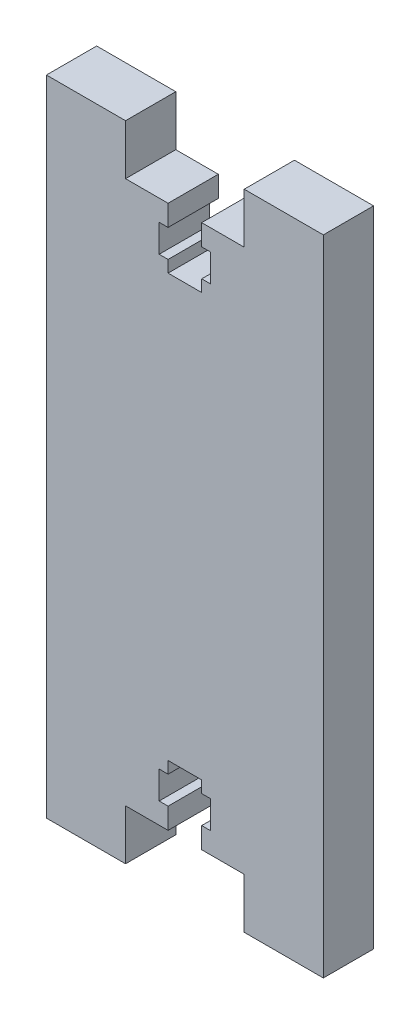
ISO-10303-21;
HEADER;
FILE_DESCRIPTION(('STEP AP214'),'2;1');
FILE_NAME('part.step','',(''),(''),'','','');
FILE_SCHEMA(('AUTOMOTIVE_DESIGN { 1 0 10303 214 1 1 1 1 }'));
ENDSEC;
DATA;
#1=APPLICATION_CONTEXT('core data for automotive mechanical design processes');
#2=APPLICATION_PROTOCOL_DEFINITION('international standard','automotive_design',2000,#1);
#3=PRODUCT_CONTEXT('',#1,'mechanical');
#4=PRODUCT('Part','Part','',(#3));
#5=PRODUCT_RELATED_PRODUCT_CATEGORY('part','',(#4));
#6=PRODUCT_DEFINITION_FORMATION('','',#4);
#7=PRODUCT_DEFINITION_CONTEXT('part definition',#1,'design');
#8=PRODUCT_DEFINITION('design','',#6,#7);
#9=PRODUCT_DEFINITION_SHAPE('','',#8);
#10=(LENGTH_UNIT() NAMED_UNIT(*) SI_UNIT(.MILLI.,.METRE.));
#11=(NAMED_UNIT(*) PLANE_ANGLE_UNIT() SI_UNIT($,.RADIAN.));
#12=(NAMED_UNIT(*) SI_UNIT($,.STERADIAN.) SOLID_ANGLE_UNIT());
#13=UNCERTAINTY_MEASURE_WITH_UNIT(LENGTH_MEASURE(1.E-05),#10,'distance_accuracy_value','');
#14=(GEOMETRIC_REPRESENTATION_CONTEXT(3) GLOBAL_UNCERTAINTY_ASSIGNED_CONTEXT((#13)) GLOBAL_UNIT_ASSIGNED_CONTEXT((#10,
#11,#12)) REPRESENTATION_CONTEXT('',''));
#15=CARTESIAN_POINT('',(0.,0.,0.));
#16=DIRECTION('',(0.,0.,1.));
#17=DIRECTION('',(1.,0.,0.));
#18=AXIS2_PLACEMENT_3D('',#15,#16,#17);
#19=CARTESIAN_POINT('',(4.24999999999902,0.,6.35));
#20=DIRECTION('',(-1.,0.,0.));
#21=DIRECTION('',(0.,-1.,0.));
#22=AXIS2_PLACEMENT_3D('',#19,#20,#21);
#23=PLANE('',#22);
#24=DIRECTION('',(0.,1.,0.));
#25=VECTOR('',#24,1.);
#26=CARTESIAN_POINT('',(4.24999999999902,0.,-6.35));
#27=LINE('',#26,#25);
#28=CARTESIAN_POINT('',(4.25000000000004,-68.65,-6.35));
#29=VERTEX_POINT('',#28);
#30=CARTESIAN_POINT('',(4.25,-63.35,-6.35));
#31=VERTEX_POINT('',#30);
#32=EDGE_CURVE('E299',#29,#31,#27,.T.);
#33=ORIENTED_EDGE('',*,*,#32,.F.);
#34=DIRECTION('',(0.,0.,-1.));
#35=VECTOR('',#34,1.);
#36=CARTESIAN_POINT('',(4.25000000000004,-68.65,6.35));
#37=LINE('',#36,#35);
#38=CARTESIAN_POINT('',(4.25000000000004,-68.65,6.35));
#39=VERTEX_POINT('',#38);
#40=EDGE_CURVE('E11',#39,#29,#37,.T.);
#41=ORIENTED_EDGE('',*,*,#40,.F.);
#42=DIRECTION('',(0.,1.,0.));
#43=VECTOR('',#42,1.);
#44=CARTESIAN_POINT('',(4.24999999999902,0.,6.35));
#45=LINE('',#44,#43);
#46=CARTESIAN_POINT('',(4.25,-63.35,6.35));
#47=VERTEX_POINT('',#46);
#48=EDGE_CURVE('E544',#39,#47,#45,.T.);
#49=ORIENTED_EDGE('',*,*,#48,.T.);
#50=DIRECTION('',(0.,0.,-1.));
#51=VECTOR('',#50,1.);
#52=CARTESIAN_POINT('',(4.25,-63.35,6.35));
#53=LINE('',#52,#51);
#54=EDGE_CURVE('E51',#47,#31,#53,.T.);
#55=ORIENTED_EDGE('',*,*,#54,.T.);
#56=EDGE_LOOP('',(#33,#41,#49,#55));
#57=FACE_BOUND('',#56,.T.);
#58=ADVANCED_FACE('F35',(#57),#23,.T.);
#59=CARTESIAN_POINT('',(0.,-68.65,6.35));
#60=DIRECTION('',(0.,1.,0.));
#61=DIRECTION('',(-1.,0.,0.));
#62=AXIS2_PLACEMENT_3D('',#59,#60,#61);
#63=PLANE('',#62);
#64=DIRECTION('',(1.,0.,0.));
#65=VECTOR('',#64,1.);
#66=CARTESIAN_POINT('',(0.,-68.65,-6.35));
#67=LINE('',#66,#65);
#68=CARTESIAN_POINT('',(15.,-68.65,-6.35));
#69=VERTEX_POINT('',#68);
#70=EDGE_CURVE('E301',#29,#69,#67,.T.);
#71=ORIENTED_EDGE('',*,*,#70,.T.);
#72=DIRECTION('',(0.,0.,-1.));
#73=VECTOR('',#72,1.);
#74=CARTESIAN_POINT('',(15.,-68.65,6.35));
#75=LINE('',#74,#73);
#76=CARTESIAN_POINT('',(15.,-68.65,6.35));
#77=VERTEX_POINT('',#76);
#78=EDGE_CURVE('E43',#77,#69,#75,.T.);
#79=ORIENTED_EDGE('',*,*,#78,.F.);
#80=DIRECTION('',(1.,0.,0.));
#81=VECTOR('',#80,1.);
#82=CARTESIAN_POINT('',(0.,-68.65,6.35));
#83=LINE('',#82,#81);
#84=EDGE_CURVE('E479',#39,#77,#83,.T.);
#85=ORIENTED_EDGE('',*,*,#84,.F.);
#86=ORIENTED_EDGE('',*,*,#40,.T.);
#87=EDGE_LOOP('',(#71,#79,#85,#86));
#88=FACE_BOUND('',#87,.T.);
#89=ADVANCED_FACE('F681',(#88),#63,.F.);
#90=CARTESIAN_POINT('',(15.,0.,6.35));
#91=DIRECTION('',(1.,0.,0.));
#92=DIRECTION('',(0.,0.,-1.));
#93=AXIS2_PLACEMENT_3D('',#90,#91,#92);
#94=PLANE('',#93);
#95=DIRECTION('',(0.,-1.,0.));
#96=VECTOR('',#95,1.);
#97=CARTESIAN_POINT('',(15.,0.,-6.35));
#98=LINE('',#97,#96);
#99=CARTESIAN_POINT('',(15.,-81.35,-6.35));
#100=VERTEX_POINT('',#99);
#101=EDGE_CURVE('E303',#69,#100,#98,.T.);
#102=ORIENTED_EDGE('',*,*,#101,.T.);
#103=DIRECTION('',(0.,0.,-1.));
#104=VECTOR('',#103,1.);
#105=CARTESIAN_POINT('',(15.,-81.35,6.35));
#106=LINE('',#105,#104);
#107=CARTESIAN_POINT('',(15.,-81.35,6.35));
#108=VERTEX_POINT('',#107);
#109=EDGE_CURVE('E453',#108,#100,#106,.T.);
#110=ORIENTED_EDGE('',*,*,#109,.F.);
#111=DIRECTION('',(0.,-1.,0.));
#112=VECTOR('',#111,1.);
#113=CARTESIAN_POINT('',(15.,0.,6.35));
#114=LINE('',#113,#112);
#115=EDGE_CURVE('E461',#77,#108,#114,.T.);
#116=ORIENTED_EDGE('',*,*,#115,.F.);
#117=ORIENTED_EDGE('',*,*,#78,.T.);
#118=EDGE_LOOP('',(#102,#110,#116,#117));
#119=FACE_BOUND('',#118,.T.);
#120=ADVANCED_FACE('F459',(#119),#94,.F.);
#121=CARTESIAN_POINT('',(0.,-81.35,6.35));
#122=DIRECTION('',(0.,-1.,0.));
#123=DIRECTION('',(1.,0.,0.));
#124=AXIS2_PLACEMENT_3D('',#121,#122,#123);
#125=PLANE('',#124);
#126=DIRECTION('',(-1.,0.,0.));
#127=VECTOR('',#126,1.);
#128=CARTESIAN_POINT('',(0.,-81.35,-6.35));
#129=LINE('',#128,#127);
#130=CARTESIAN_POINT('',(35.,-81.35,-6.35));
#131=VERTEX_POINT('',#130);
#132=EDGE_CURVE('E307',#131,#100,#129,.T.);
#133=ORIENTED_EDGE('',*,*,#132,.F.);
#134=DIRECTION('',(0.,0.,-1.));
#135=VECTOR('',#134,1.);
#136=CARTESIAN_POINT('',(35.,-81.35,6.35));
#137=LINE('',#136,#135);
#138=CARTESIAN_POINT('',(35.,-81.35,6.35));
#139=VERTEX_POINT('',#138);
#140=EDGE_CURVE('E451',#139,#131,#137,.T.);
#141=ORIENTED_EDGE('',*,*,#140,.F.);
#142=DIRECTION('',(-1.,0.,0.));
#143=VECTOR('',#142,1.);
#144=CARTESIAN_POINT('',(0.,-81.35,6.35));
#145=LINE('',#144,#143);
#146=EDGE_CURVE('E474',#139,#108,#145,.T.);
#147=ORIENTED_EDGE('',*,*,#146,.T.);
#148=ORIENTED_EDGE('',*,*,#109,.T.);
#149=EDGE_LOOP('',(#133,#141,#147,#148));
#150=FACE_BOUND('',#149,.T.);
#151=ADVANCED_FACE('F470',(#150),#125,.T.);
#152=CARTESIAN_POINT('',(35.,0.,6.35));
#153=DIRECTION('',(-1.,0.,0.));
#154=DIRECTION('',(0.,0.,1.));
#155=AXIS2_PLACEMENT_3D('',#152,#153,#154);
#156=PLANE('',#155);
#157=DIRECTION('',(0.,1.,0.));
#158=VECTOR('',#157,1.);
#159=CARTESIAN_POINT('',(35.,0.,-6.35));
#160=LINE('',#159,#158);
#161=CARTESIAN_POINT('',(35.,81.35,-6.35));
#162=VERTEX_POINT('',#161);
#163=EDGE_CURVE('E310',#131,#162,#160,.T.);
#164=ORIENTED_EDGE('',*,*,#163,.T.);
#165=DIRECTION('',(0.,0.,-1.));
#166=VECTOR('',#165,1.);
#167=CARTESIAN_POINT('',(35.,81.35,6.35));
#168=LINE('',#167,#166);
#169=CARTESIAN_POINT('',(35.,81.35,6.35));
#170=VERTEX_POINT('',#169);
#171=EDGE_CURVE('E448',#170,#162,#168,.T.);
#172=ORIENTED_EDGE('',*,*,#171,.F.);
#173=DIRECTION('',(0.,1.,0.));
#174=VECTOR('',#173,1.);
#175=CARTESIAN_POINT('',(35.,0.,6.35));
#176=LINE('',#175,#174);
#177=EDGE_CURVE('E475',#139,#170,#176,.T.);
#178=ORIENTED_EDGE('',*,*,#177,.F.);
#179=ORIENTED_EDGE('',*,*,#140,.T.);
#180=EDGE_LOOP('',(#164,#172,#178,#179));
#181=FACE_BOUND('',#180,.T.);
#182=ADVANCED_FACE('F669',(#181),#156,.F.);
#183=CARTESIAN_POINT('',(0.,81.35,6.35));
#184=DIRECTION('',(0.,-1.,0.));
#185=DIRECTION('',(1.,0.,0.));
#186=AXIS2_PLACEMENT_3D('',#183,#184,#185);
#187=PLANE('',#186);
#188=DIRECTION('',(-1.,0.,0.));
#189=VECTOR('',#188,1.);
#190=CARTESIAN_POINT('',(0.,81.35,-6.35));
#191=LINE('',#190,#189);
#192=CARTESIAN_POINT('',(15.,81.35,-6.35));
#193=VERTEX_POINT('',#192);
#194=EDGE_CURVE('E312',#162,#193,#191,.T.);
#195=ORIENTED_EDGE('',*,*,#194,.T.);
#196=DIRECTION('',(0.,0.,-1.));
#197=VECTOR('',#196,1.);
#198=CARTESIAN_POINT('',(15.,81.35,6.35));
#199=LINE('',#198,#197);
#200=CARTESIAN_POINT('',(15.,81.35,6.35));
#201=VERTEX_POINT('',#200);
#202=EDGE_CURVE('E446',#201,#193,#199,.T.);
#203=ORIENTED_EDGE('',*,*,#202,.F.);
#204=DIRECTION('',(-1.,0.,0.));
#205=VECTOR('',#204,1.);
#206=CARTESIAN_POINT('',(0.,81.35,6.35));
#207=LINE('',#206,#205);
#208=EDGE_CURVE('E477',#170,#201,#207,.T.);
#209=ORIENTED_EDGE('',*,*,#208,.F.);
#210=ORIENTED_EDGE('',*,*,#171,.T.);
#211=EDGE_LOOP('',(#195,#203,#209,#210));
#212=FACE_BOUND('',#211,.T.);
#213=ADVANCED_FACE('F666',(#212),#187,.F.);
#214=CARTESIAN_POINT('',(15.,0.,6.35));
#215=DIRECTION('',(-1.,0.,0.));
#216=DIRECTION('',(0.,0.,1.));
#217=AXIS2_PLACEMENT_3D('',#214,#215,#216);
#218=PLANE('',#217);
#219=DIRECTION('',(0.,1.,0.));
#220=VECTOR('',#219,1.);
#221=CARTESIAN_POINT('',(15.,0.,-6.35));
#222=LINE('',#221,#220);
#223=CARTESIAN_POINT('',(15.,68.65,-6.35));
#224=VERTEX_POINT('',#223);
#225=EDGE_CURVE('E315',#224,#193,#222,.T.);
#226=ORIENTED_EDGE('',*,*,#225,.F.);
#227=DIRECTION('',(0.,0.,-1.));
#228=VECTOR('',#227,1.);
#229=CARTESIAN_POINT('',(15.,68.65,6.35));
#230=LINE('',#229,#228);
#231=CARTESIAN_POINT('',(15.,68.65,6.35));
#232=VERTEX_POINT('',#231);
#233=EDGE_CURVE('E444',#232,#224,#230,.T.);
#234=ORIENTED_EDGE('',*,*,#233,.F.);
#235=DIRECTION('',(0.,1.,0.));
#236=VECTOR('',#235,1.);
#237=CARTESIAN_POINT('',(15.,0.,6.35));
#238=LINE('',#237,#236);
#239=EDGE_CURVE('E484',#232,#201,#238,.T.);
#240=ORIENTED_EDGE('',*,*,#239,.T.);
#241=ORIENTED_EDGE('',*,*,#202,.T.);
#242=EDGE_LOOP('',(#226,#234,#240,#241));
#243=FACE_BOUND('',#242,.T.);
#244=ADVANCED_FACE('F661',(#243),#218,.T.);
#245=CARTESIAN_POINT('',(0.,68.65,6.35));
#246=DIRECTION('',(0.,1.,0.));
#247=DIRECTION('',(-1.,0.,0.));
#248=AXIS2_PLACEMENT_3D('',#245,#246,#247);
#249=PLANE('',#248);
#250=DIRECTION('',(1.,0.,0.));
#251=VECTOR('',#250,1.);
#252=CARTESIAN_POINT('',(0.,68.65,-6.35));
#253=LINE('',#252,#251);
#254=CARTESIAN_POINT('',(4.25,68.65,-6.35));
#255=VERTEX_POINT('',#254);
#256=EDGE_CURVE('E318',#255,#224,#253,.T.);
#257=ORIENTED_EDGE('',*,*,#256,.F.);
#258=DIRECTION('',(0.,0.,-1.));
#259=VECTOR('',#258,1.);
#260=CARTESIAN_POINT('',(4.25,68.65,6.35));
#261=LINE('',#260,#259);
#262=CARTESIAN_POINT('',(4.25,68.65,6.35));
#263=VERTEX_POINT('',#262);
#264=EDGE_CURVE('E442',#263,#255,#261,.T.);
#265=ORIENTED_EDGE('',*,*,#264,.F.);
#266=DIRECTION('',(1.,0.,0.));
#267=VECTOR('',#266,1.);
#268=CARTESIAN_POINT('',(0.,68.65,6.35));
#269=LINE('',#268,#267);
#270=EDGE_CURVE('E487',#263,#232,#269,.T.);
#271=ORIENTED_EDGE('',*,*,#270,.T.);
#272=ORIENTED_EDGE('',*,*,#233,.T.);
#273=EDGE_LOOP('',(#257,#265,#271,#272));
#274=FACE_BOUND('',#273,.T.);
#275=ADVANCED_FACE('F658',(#274),#249,.T.);
#276=CARTESIAN_POINT('',(4.25000000000003,0.,6.35));
#277=DIRECTION('',(1.,0.,0.));
#278=DIRECTION('',(0.,1.,0.));
#279=AXIS2_PLACEMENT_3D('',#276,#277,#278);
#280=PLANE('',#279);
#281=DIRECTION('',(0.,-1.,0.));
#282=VECTOR('',#281,1.);
#283=CARTESIAN_POINT('',(4.25000000000003,0.,-6.35));
#284=LINE('',#283,#282);
#285=CARTESIAN_POINT('',(4.25,63.35,-6.35));
#286=VERTEX_POINT('',#285);
#287=EDGE_CURVE('E321',#255,#286,#284,.T.);
#288=ORIENTED_EDGE('',*,*,#287,.T.);
#289=DIRECTION('',(0.,0.,-1.));
#290=VECTOR('',#289,1.);
#291=CARTESIAN_POINT('',(4.25,63.35,6.35));
#292=LINE('',#291,#290);
#293=CARTESIAN_POINT('',(4.25,63.35,6.35));
#294=VERTEX_POINT('',#293);
#295=EDGE_CURVE('E439',#294,#286,#292,.T.);
#296=ORIENTED_EDGE('',*,*,#295,.F.);
#297=DIRECTION('',(0.,-1.,0.));
#298=VECTOR('',#297,1.);
#299=CARTESIAN_POINT('',(4.25000000000003,0.,6.35));
#300=LINE('',#299,#298);
#301=EDGE_CURVE('E490',#263,#294,#300,.T.);
#302=ORIENTED_EDGE('',*,*,#301,.F.);
#303=ORIENTED_EDGE('',*,*,#264,.T.);
#304=EDGE_LOOP('',(#288,#296,#302,#303));
#305=FACE_BOUND('',#304,.T.);
#306=ADVANCED_FACE('F655',(#305),#280,.F.);
#307=CARTESIAN_POINT('',(0.,63.35,6.35));
#308=DIRECTION('',(0.,1.,0.));
#309=DIRECTION('',(0.,0.,1.));
#310=AXIS2_PLACEMENT_3D('',#307,#308,#309);
#311=PLANE('',#310);
#312=DIRECTION('',(1.,0.,0.));
#313=VECTOR('',#312,1.);
#314=CARTESIAN_POINT('',(0.,63.35,-6.35));
#315=LINE('',#314,#313);
#316=CARTESIAN_POINT('',(6.5,63.35,-6.35));
#317=VERTEX_POINT('',#316);
#318=EDGE_CURVE('E324',#286,#317,#315,.T.);
#319=ORIENTED_EDGE('',*,*,#318,.T.);
#320=DIRECTION('',(0.,0.,-1.));
#321=VECTOR('',#320,1.);
#322=CARTESIAN_POINT('',(6.5,63.35,6.35));
#323=LINE('',#322,#321);
#324=CARTESIAN_POINT('',(6.5,63.35,6.35));
#325=VERTEX_POINT('',#324);
#326=EDGE_CURVE('E436',#325,#317,#323,.T.);
#327=ORIENTED_EDGE('',*,*,#326,.F.);
#328=DIRECTION('',(1.,0.,0.));
#329=VECTOR('',#328,1.);
#330=CARTESIAN_POINT('',(0.,63.35,6.35));
#331=LINE('',#330,#329);
#332=EDGE_CURVE('E493',#294,#325,#331,.T.);
#333=ORIENTED_EDGE('',*,*,#332,.F.);
#334=ORIENTED_EDGE('',*,*,#295,.T.);
#335=EDGE_LOOP('',(#319,#327,#333,#334));
#336=FACE_BOUND('',#335,.T.);
#337=ADVANCED_FACE('F650',(#336),#311,.F.);
#338=CARTESIAN_POINT('',(6.50000000000001,0.,6.35));
#339=DIRECTION('',(1.,0.,0.));
#340=DIRECTION('',(0.,1.,0.));
#341=AXIS2_PLACEMENT_3D('',#338,#339,#340);
#342=PLANE('',#341);
#343=DIRECTION('',(0.,-1.,0.));
#344=VECTOR('',#343,1.);
#345=CARTESIAN_POINT('',(6.50000000000001,0.,-6.35));
#346=LINE('',#345,#344);
#347=CARTESIAN_POINT('',(6.5,56.35,-6.35));
#348=VERTEX_POINT('',#347);
#349=EDGE_CURVE('E326',#317,#348,#346,.T.);
#350=ORIENTED_EDGE('',*,*,#349,.T.);
#351=DIRECTION('',(0.,0.,-1.));
#352=VECTOR('',#351,1.);
#353=CARTESIAN_POINT('',(6.5,56.35,6.35));
#354=LINE('',#353,#352);
#355=CARTESIAN_POINT('',(6.5,56.35,6.35));
#356=VERTEX_POINT('',#355);
#357=EDGE_CURVE('E434',#356,#348,#354,.T.);
#358=ORIENTED_EDGE('',*,*,#357,.F.);
#359=DIRECTION('',(0.,-1.,0.));
#360=VECTOR('',#359,1.);
#361=CARTESIAN_POINT('',(6.50000000000001,0.,6.35));
#362=LINE('',#361,#360);
#363=EDGE_CURVE('E495',#325,#356,#362,.T.);
#364=ORIENTED_EDGE('',*,*,#363,.F.);
#365=ORIENTED_EDGE('',*,*,#326,.T.);
#366=EDGE_LOOP('',(#350,#358,#364,#365));
#367=FACE_BOUND('',#366,.T.);
#368=ADVANCED_FACE('F644',(#367),#342,.F.);
#369=CARTESIAN_POINT('',(0.,56.35,6.35));
#370=DIRECTION('',(0.,1.,0.));
#371=DIRECTION('',(0.,0.,1.));
#372=AXIS2_PLACEMENT_3D('',#369,#370,#371);
#373=PLANE('',#372);
#374=DIRECTION('',(1.,0.,0.));
#375=VECTOR('',#374,1.);
#376=CARTESIAN_POINT('',(0.,56.35,-6.35));
#377=LINE('',#376,#375);
#378=CARTESIAN_POINT('',(4.25,56.35,-6.35));
#379=VERTEX_POINT('',#378);
#380=EDGE_CURVE('E330',#379,#348,#377,.T.);
#381=ORIENTED_EDGE('',*,*,#380,.F.);
#382=DIRECTION('',(0.,0.,-1.));
#383=VECTOR('',#382,1.);
#384=CARTESIAN_POINT('',(4.25,56.35,6.35));
#385=LINE('',#384,#383);
#386=CARTESIAN_POINT('',(4.25,56.35,6.35));
#387=VERTEX_POINT('',#386);
#388=EDGE_CURVE('E432',#387,#379,#385,.T.);
#389=ORIENTED_EDGE('',*,*,#388,.F.);
#390=DIRECTION('',(1.,0.,0.));
#391=VECTOR('',#390,1.);
#392=CARTESIAN_POINT('',(0.,56.35,6.35));
#393=LINE('',#392,#391);
#394=EDGE_CURVE('E498',#387,#356,#393,.T.);
#395=ORIENTED_EDGE('',*,*,#394,.T.);
#396=ORIENTED_EDGE('',*,*,#357,.T.);
#397=EDGE_LOOP('',(#381,#389,#395,#396));
#398=FACE_BOUND('',#397,.T.);
#399=ADVANCED_FACE('F639',(#398),#373,.T.);
#400=CARTESIAN_POINT('',(4.24999999999997,0.,6.35));
#401=DIRECTION('',(1.,0.,0.));
#402=DIRECTION('',(0.,1.,0.));
#403=AXIS2_PLACEMENT_3D('',#400,#401,#402);
#404=PLANE('',#403);
#405=DIRECTION('',(0.,-1.,0.));
#406=VECTOR('',#405,1.);
#407=CARTESIAN_POINT('',(4.24999999999997,0.,-6.35));
#408=LINE('',#407,#406);
#409=CARTESIAN_POINT('',(4.25,53.35,-6.35));
#410=VERTEX_POINT('',#409);
#411=EDGE_CURVE('E333',#379,#410,#408,.T.);
#412=ORIENTED_EDGE('',*,*,#411,.T.);
#413=DIRECTION('',(0.,0.,-1.));
#414=VECTOR('',#413,1.);
#415=CARTESIAN_POINT('',(4.25,53.35,6.35));
#416=LINE('',#415,#414);
#417=CARTESIAN_POINT('',(4.25,53.35,6.35));
#418=VERTEX_POINT('',#417);
#419=EDGE_CURVE('E430',#418,#410,#416,.T.);
#420=ORIENTED_EDGE('',*,*,#419,.F.);
#421=DIRECTION('',(0.,-1.,0.));
#422=VECTOR('',#421,1.);
#423=CARTESIAN_POINT('',(4.24999999999997,0.,6.35));
#424=LINE('',#423,#422);
#425=EDGE_CURVE('E501',#387,#418,#424,.T.);
#426=ORIENTED_EDGE('',*,*,#425,.F.);
#427=ORIENTED_EDGE('',*,*,#388,.T.);
#428=EDGE_LOOP('',(#412,#420,#426,#427));
#429=FACE_BOUND('',#428,.T.);
#430=ADVANCED_FACE('F635',(#429),#404,.F.);
#431=CARTESIAN_POINT('',(0.,53.35,6.35));
#432=DIRECTION('',(0.,1.,0.));
#433=DIRECTION('',(0.,0.,1.));
#434=AXIS2_PLACEMENT_3D('',#431,#432,#433);
#435=PLANE('',#434);
#436=DIRECTION('',(1.,0.,0.));
#437=VECTOR('',#436,1.);
#438=CARTESIAN_POINT('',(0.,53.35,-6.35));
#439=LINE('',#438,#437);
#440=CARTESIAN_POINT('',(-4.25,53.35,-6.35));
#441=VERTEX_POINT('',#440);
#442=EDGE_CURVE('E337',#441,#410,#439,.T.);
#443=ORIENTED_EDGE('',*,*,#442,.F.);
#444=DIRECTION('',(0.,0.,-1.));
#445=VECTOR('',#444,1.);
#446=CARTESIAN_POINT('',(-4.25,53.35,6.35));
#447=LINE('',#446,#445);
#448=CARTESIAN_POINT('',(-4.25,53.35,6.35));
#449=VERTEX_POINT('',#448);
#450=EDGE_CURVE('E428',#449,#441,#447,.T.);
#451=ORIENTED_EDGE('',*,*,#450,.F.);
#452=DIRECTION('',(1.,0.,0.));
#453=VECTOR('',#452,1.);
#454=CARTESIAN_POINT('',(0.,53.35,6.35));
#455=LINE('',#454,#453);
#456=EDGE_CURVE('E504',#449,#418,#455,.T.);
#457=ORIENTED_EDGE('',*,*,#456,.T.);
#458=ORIENTED_EDGE('',*,*,#419,.T.);
#459=EDGE_LOOP('',(#443,#451,#457,#458));
#460=FACE_BOUND('',#459,.T.);
#461=ADVANCED_FACE('F631',(#460),#435,.T.);
#462=CARTESIAN_POINT('',(-4.24999999999998,0.,6.35));
#463=DIRECTION('',(1.,0.,0.));
#464=DIRECTION('',(0.,1.,0.));
#465=AXIS2_PLACEMENT_3D('',#462,#463,#464);
#466=PLANE('',#465);
#467=DIRECTION('',(0.,-1.,0.));
#468=VECTOR('',#467,1.);
#469=CARTESIAN_POINT('',(-4.24999999999998,0.,-6.35));
#470=LINE('',#469,#468);
#471=CARTESIAN_POINT('',(-4.25,56.35,-6.35));
#472=VERTEX_POINT('',#471);
#473=EDGE_CURVE('E340',#472,#441,#470,.T.);
#474=ORIENTED_EDGE('',*,*,#473,.F.);
#475=DIRECTION('',(0.,0.,-1.));
#476=VECTOR('',#475,1.);
#477=CARTESIAN_POINT('',(-4.25,56.35,6.35));
#478=LINE('',#477,#476);
#479=CARTESIAN_POINT('',(-4.25,56.35,6.35));
#480=VERTEX_POINT('',#479);
#481=EDGE_CURVE('E426',#480,#472,#478,.T.);
#482=ORIENTED_EDGE('',*,*,#481,.F.);
#483=DIRECTION('',(0.,-1.,0.));
#484=VECTOR('',#483,1.);
#485=CARTESIAN_POINT('',(-4.24999999999998,0.,6.35));
#486=LINE('',#485,#484);
#487=EDGE_CURVE('E507',#480,#449,#486,.T.);
#488=ORIENTED_EDGE('',*,*,#487,.T.);
#489=ORIENTED_EDGE('',*,*,#450,.T.);
#490=EDGE_LOOP('',(#474,#482,#488,#489));
#491=FACE_BOUND('',#490,.T.);
#492=ADVANCED_FACE('F627',(#491),#466,.T.);
#493=CARTESIAN_POINT('',(-6.5,56.35,-6.35));
#494=VERTEX_POINT('',#493);
#495=EDGE_CURVE('E334',#494,#472,#377,.T.);
#496=ORIENTED_EDGE('',*,*,#495,.F.);
#497=DIRECTION('',(0.,0.,-1.));
#498=VECTOR('',#497,1.);
#499=CARTESIAN_POINT('',(-6.5,56.35,6.35));
#500=LINE('',#499,#498);
#501=CARTESIAN_POINT('',(-6.5,56.35,6.35));
#502=VERTEX_POINT('',#501);
#503=EDGE_CURVE('E424',#502,#494,#500,.T.);
#504=ORIENTED_EDGE('',*,*,#503,.F.);
#505=EDGE_CURVE('E502',#502,#480,#393,.T.);
#506=ORIENTED_EDGE('',*,*,#505,.T.);
#507=ORIENTED_EDGE('',*,*,#481,.T.);
#508=EDGE_LOOP('',(#496,#504,#506,#507));
#509=FACE_BOUND('',#508,.T.);
#510=ADVANCED_FACE('F622',(#509),#373,.T.);
#511=CARTESIAN_POINT('',(-6.49999999999999,0.,6.35));
#512=DIRECTION('',(1.,0.,0.));
#513=DIRECTION('',(0.,1.,0.));
#514=AXIS2_PLACEMENT_3D('',#511,#512,#513);
#515=PLANE('',#514);
#516=DIRECTION('',(0.,-1.,0.));
#517=VECTOR('',#516,1.);
#518=CARTESIAN_POINT('',(-6.49999999999999,0.,-6.35));
#519=LINE('',#518,#517);
#520=CARTESIAN_POINT('',(-6.5,63.35,-6.35));
#521=VERTEX_POINT('',#520);
#522=EDGE_CURVE('E343',#521,#494,#519,.T.);
#523=ORIENTED_EDGE('',*,*,#522,.F.);
#524=DIRECTION('',(0.,0.,-1.));
#525=VECTOR('',#524,1.);
#526=CARTESIAN_POINT('',(-6.5,63.35,6.35));
#527=LINE('',#526,#525);
#528=CARTESIAN_POINT('',(-6.5,63.35,6.35));
#529=VERTEX_POINT('',#528);
#530=EDGE_CURVE('E422',#529,#521,#527,.T.);
#531=ORIENTED_EDGE('',*,*,#530,.F.);
#532=DIRECTION('',(0.,-1.,0.));
#533=VECTOR('',#532,1.);
#534=CARTESIAN_POINT('',(-6.49999999999999,0.,6.35));
#535=LINE('',#534,#533);
#536=EDGE_CURVE('E510',#529,#502,#535,.T.);
#537=ORIENTED_EDGE('',*,*,#536,.T.);
#538=ORIENTED_EDGE('',*,*,#503,.T.);
#539=EDGE_LOOP('',(#523,#531,#537,#538));
#540=FACE_BOUND('',#539,.T.);
#541=ADVANCED_FACE('F615',(#540),#515,.T.);
#542=CARTESIAN_POINT('',(-4.25,63.35,-6.35));
#543=VERTEX_POINT('',#542);
#544=EDGE_CURVE('E327',#521,#543,#315,.T.);
#545=ORIENTED_EDGE('',*,*,#544,.T.);
#546=DIRECTION('',(0.,0.,-1.));
#547=VECTOR('',#546,1.);
#548=CARTESIAN_POINT('',(-4.25,63.35,6.35));
#549=LINE('',#548,#547);
#550=CARTESIAN_POINT('',(-4.25,63.35,6.35));
#551=VERTEX_POINT('',#550);
#552=EDGE_CURVE('E420',#551,#543,#549,.T.);
#553=ORIENTED_EDGE('',*,*,#552,.F.);
#554=EDGE_CURVE('E496',#529,#551,#331,.T.);
#555=ORIENTED_EDGE('',*,*,#554,.F.);
#556=ORIENTED_EDGE('',*,*,#530,.T.);
#557=EDGE_LOOP('',(#545,#553,#555,#556));
#558=FACE_BOUND('',#557,.T.);
#559=ADVANCED_FACE('F670',(#558),#311,.F.);
#560=CARTESIAN_POINT('',(-4.24999999999999,0.,6.35));
#561=DIRECTION('',(1.,0.,0.));
#562=DIRECTION('',(0.,1.,0.));
#563=AXIS2_PLACEMENT_3D('',#560,#561,#562);
#564=PLANE('',#563);
#565=DIRECTION('',(0.,-1.,0.));
#566=VECTOR('',#565,1.);
#567=CARTESIAN_POINT('',(-4.24999999999999,0.,-6.35));
#568=LINE('',#567,#566);
#569=CARTESIAN_POINT('',(-4.25,68.65,-6.35));
#570=VERTEX_POINT('',#569);
#571=EDGE_CURVE('E346',#570,#543,#568,.T.);
#572=ORIENTED_EDGE('',*,*,#571,.F.);
#573=DIRECTION('',(0.,0.,-1.));
#574=VECTOR('',#573,1.);
#575=CARTESIAN_POINT('',(-4.25,68.65,6.35));
#576=LINE('',#575,#574);
#577=CARTESIAN_POINT('',(-4.25,68.65,6.35));
#578=VERTEX_POINT('',#577);
#579=EDGE_CURVE('E418',#578,#570,#576,.T.);
#580=ORIENTED_EDGE('',*,*,#579,.F.);
#581=DIRECTION('',(0.,-1.,0.));
#582=VECTOR('',#581,1.);
#583=CARTESIAN_POINT('',(-4.24999999999999,0.,6.35));
#584=LINE('',#583,#582);
#585=EDGE_CURVE('E513',#578,#551,#584,.T.);
#586=ORIENTED_EDGE('',*,*,#585,.T.);
#587=ORIENTED_EDGE('',*,*,#552,.T.);
#588=EDGE_LOOP('',(#572,#580,#586,#587));
#589=FACE_BOUND('',#588,.T.);
#590=ADVANCED_FACE('F607',(#589),#564,.T.);
#591=CARTESIAN_POINT('',(-15.,68.65,-6.35));
#592=VERTEX_POINT('',#591);
#593=EDGE_CURVE('E322',#592,#570,#253,.T.);
#594=ORIENTED_EDGE('',*,*,#593,.F.);
#595=DIRECTION('',(0.,0.,-1.));
#596=VECTOR('',#595,1.);
#597=CARTESIAN_POINT('',(-15.,68.65,6.35));
#598=LINE('',#597,#596);
#599=CARTESIAN_POINT('',(-15.,68.65,6.35));
#600=VERTEX_POINT('',#599);
#601=EDGE_CURVE('E416',#600,#592,#598,.T.);
#602=ORIENTED_EDGE('',*,*,#601,.F.);
#603=EDGE_CURVE('E491',#600,#578,#269,.T.);
#604=ORIENTED_EDGE('',*,*,#603,.T.);
#605=ORIENTED_EDGE('',*,*,#579,.T.);
#606=EDGE_LOOP('',(#594,#602,#604,#605));
#607=FACE_BOUND('',#606,.T.);
#608=ADVANCED_FACE('F600',(#607),#249,.T.);
#609=CARTESIAN_POINT('',(-15.,0.,6.35));
#610=DIRECTION('',(-1.,0.,0.));
#611=DIRECTION('',(0.,0.,1.));
#612=AXIS2_PLACEMENT_3D('',#609,#610,#611);
#613=PLANE('',#612);
#614=DIRECTION('',(0.,1.,0.));
#615=VECTOR('',#614,1.);
#616=CARTESIAN_POINT('',(-15.,0.,-6.35));
#617=LINE('',#616,#615);
#618=CARTESIAN_POINT('',(-15.,81.35,-6.35));
#619=VERTEX_POINT('',#618);
#620=EDGE_CURVE('E349',#592,#619,#617,.T.);
#621=ORIENTED_EDGE('',*,*,#620,.T.);
#622=DIRECTION('',(0.,0.,-1.));
#623=VECTOR('',#622,1.);
#624=CARTESIAN_POINT('',(-15.,81.35,6.35));
#625=LINE('',#624,#623);
#626=CARTESIAN_POINT('',(-15.,81.35,6.35));
#627=VERTEX_POINT('',#626);
#628=EDGE_CURVE('E414',#627,#619,#625,.T.);
#629=ORIENTED_EDGE('',*,*,#628,.F.);
#630=DIRECTION('',(0.,1.,0.));
#631=VECTOR('',#630,1.);
#632=CARTESIAN_POINT('',(-15.,0.,6.35));
#633=LINE('',#632,#631);
#634=EDGE_CURVE('E516',#600,#627,#633,.T.);
#635=ORIENTED_EDGE('',*,*,#634,.F.);
#636=ORIENTED_EDGE('',*,*,#601,.T.);
#637=EDGE_LOOP('',(#621,#629,#635,#636));
#638=FACE_BOUND('',#637,.T.);
#639=ADVANCED_FACE('F705',(#638),#613,.F.);
#640=CARTESIAN_POINT('',(1.69343705724856E-13,81.35,6.35));
#641=DIRECTION('',(0.,1.,0.));
#642=DIRECTION('',(-1.,0.,0.));
#643=AXIS2_PLACEMENT_3D('',#640,#641,#642);
#644=PLANE('',#643);
#645=DIRECTION('',(1.,0.,0.));
#646=VECTOR('',#645,1.);
#647=CARTESIAN_POINT('',(1.69343705724856E-13,81.35,-6.35));
#648=LINE('',#647,#646);
#649=CARTESIAN_POINT('',(-35.,81.35,-6.35));
#650=VERTEX_POINT('',#649);
#651=EDGE_CURVE('E352',#650,#619,#648,.T.);
#652=ORIENTED_EDGE('',*,*,#651,.F.);
#653=DIRECTION('',(0.,0.,-1.));
#654=VECTOR('',#653,1.);
#655=CARTESIAN_POINT('',(-35.,81.35,6.35));
#656=LINE('',#655,#654);
#657=CARTESIAN_POINT('',(-35.,81.35,6.35));
#658=VERTEX_POINT('',#657);
#659=EDGE_CURVE('E412',#658,#650,#656,.T.);
#660=ORIENTED_EDGE('',*,*,#659,.F.);
#661=DIRECTION('',(1.,0.,0.));
#662=VECTOR('',#661,1.);
#663=CARTESIAN_POINT('',(1.69343705724856E-13,81.35,6.35));
#664=LINE('',#663,#662);
#665=EDGE_CURVE('E518',#658,#627,#664,.T.);
#666=ORIENTED_EDGE('',*,*,#665,.T.);
#667=ORIENTED_EDGE('',*,*,#628,.T.);
#668=EDGE_LOOP('',(#652,#660,#666,#667));
#669=FACE_BOUND('',#668,.T.);
#670=ADVANCED_FACE('F593',(#669),#644,.T.);
#671=CARTESIAN_POINT('',(-35.,0.,6.35));
#672=DIRECTION('',(-1.,0.,0.));
#673=DIRECTION('',(0.,0.,1.));
#674=AXIS2_PLACEMENT_3D('',#671,#672,#673);
#675=PLANE('',#674);
#676=DIRECTION('',(0.,1.,0.));
#677=VECTOR('',#676,1.);
#678=CARTESIAN_POINT('',(-35.,0.,-6.35));
#679=LINE('',#678,#677);
#680=CARTESIAN_POINT('',(-35.,-81.35,-6.35));
#681=VERTEX_POINT('',#680);
#682=EDGE_CURVE('E355',#681,#650,#679,.T.);
#683=ORIENTED_EDGE('',*,*,#682,.F.);
#684=DIRECTION('',(0.,0.,-1.));
#685=VECTOR('',#684,1.);
#686=CARTESIAN_POINT('',(-35.,-81.35,6.35));
#687=LINE('',#686,#685);
#688=CARTESIAN_POINT('',(-35.,-81.35,6.35));
#689=VERTEX_POINT('',#688);
#690=EDGE_CURVE('E410',#689,#681,#687,.T.);
#691=ORIENTED_EDGE('',*,*,#690,.F.);
#692=DIRECTION('',(0.,1.,0.));
#693=VECTOR('',#692,1.);
#694=CARTESIAN_POINT('',(-35.,0.,6.35));
#695=LINE('',#694,#693);
#696=EDGE_CURVE('E521',#689,#658,#695,.T.);
#697=ORIENTED_EDGE('',*,*,#696,.T.);
#698=ORIENTED_EDGE('',*,*,#659,.T.);
#699=EDGE_LOOP('',(#683,#691,#697,#698));
#700=FACE_BOUND('',#699,.T.);
#701=ADVANCED_FACE('F588',(#700),#675,.T.);
#702=CARTESIAN_POINT('',(1.12895803816571E-13,-81.35,6.35));
#703=DIRECTION('',(0.,1.,0.));
#704=DIRECTION('',(-1.,0.,0.));
#705=AXIS2_PLACEMENT_3D('',#702,#703,#704);
#706=PLANE('',#705);
#707=DIRECTION('',(1.,0.,0.));
#708=VECTOR('',#707,1.);
#709=CARTESIAN_POINT('',(1.12895803816571E-13,-81.35,-6.35));
#710=LINE('',#709,#708);
#711=CARTESIAN_POINT('',(-15.,-81.35,-6.35));
#712=VERTEX_POINT('',#711);
#713=EDGE_CURVE('E358',#681,#712,#710,.T.);
#714=ORIENTED_EDGE('',*,*,#713,.T.);
#715=DIRECTION('',(0.,0.,-1.));
#716=VECTOR('',#715,1.);
#717=CARTESIAN_POINT('',(-15.,-81.35,6.35));
#718=LINE('',#717,#716);
#719=CARTESIAN_POINT('',(-15.,-81.35,6.35));
#720=VERTEX_POINT('',#719);
#721=EDGE_CURVE('E408',#720,#712,#718,.T.);
#722=ORIENTED_EDGE('',*,*,#721,.F.);
#723=DIRECTION('',(1.,0.,0.));
#724=VECTOR('',#723,1.);
#725=CARTESIAN_POINT('',(1.12895803816571E-13,-81.35,6.35));
#726=LINE('',#725,#724);
#727=EDGE_CURVE('E524',#689,#720,#726,.T.);
#728=ORIENTED_EDGE('',*,*,#727,.F.);
#729=ORIENTED_EDGE('',*,*,#690,.T.);
#730=EDGE_LOOP('',(#714,#722,#728,#729));
#731=FACE_BOUND('',#730,.T.);
#732=ADVANCED_FACE('F585',(#731),#706,.F.);
#733=CARTESIAN_POINT('',(-15.,0.,6.35));
#734=DIRECTION('',(1.,0.,0.));
#735=DIRECTION('',(0.,0.,-1.));
#736=AXIS2_PLACEMENT_3D('',#733,#734,#735);
#737=PLANE('',#736);
#738=DIRECTION('',(0.,-1.,0.));
#739=VECTOR('',#738,1.);
#740=CARTESIAN_POINT('',(-15.,0.,-6.35));
#741=LINE('',#740,#739);
#742=CARTESIAN_POINT('',(-15.,-68.65,-6.35));
#743=VERTEX_POINT('',#742);
#744=EDGE_CURVE('E361',#743,#712,#741,.T.);
#745=ORIENTED_EDGE('',*,*,#744,.F.);
#746=DIRECTION('',(0.,0.,-1.));
#747=VECTOR('',#746,1.);
#748=CARTESIAN_POINT('',(-15.,-68.65,6.35));
#749=LINE('',#748,#747);
#750=CARTESIAN_POINT('',(-15.,-68.65,6.35));
#751=VERTEX_POINT('',#750);
#752=EDGE_CURVE('E406',#751,#743,#749,.T.);
#753=ORIENTED_EDGE('',*,*,#752,.F.);
#754=DIRECTION('',(0.,-1.,0.));
#755=VECTOR('',#754,1.);
#756=CARTESIAN_POINT('',(-15.,0.,6.35));
#757=LINE('',#756,#755);
#758=EDGE_CURVE('E526',#751,#720,#757,.T.);
#759=ORIENTED_EDGE('',*,*,#758,.T.);
#760=ORIENTED_EDGE('',*,*,#721,.T.);
#761=EDGE_LOOP('',(#745,#753,#759,#760));
#762=FACE_BOUND('',#761,.T.);
#763=ADVANCED_FACE('F581',(#762),#737,.T.);
#764=CARTESIAN_POINT('',(-4.24999999999996,-68.65,-6.35));
#765=VERTEX_POINT('',#764);
#766=EDGE_CURVE('E304',#743,#765,#67,.T.);
#767=ORIENTED_EDGE('',*,*,#766,.T.);
#768=DIRECTION('',(0.,0.,-1.));
#769=VECTOR('',#768,1.);
#770=CARTESIAN_POINT('',(-4.24999999999996,-68.65,6.35));
#771=LINE('',#770,#769);
#772=CARTESIAN_POINT('',(-4.24999999999996,-68.65,6.35));
#773=VERTEX_POINT('',#772);
#774=EDGE_CURVE('E403',#773,#765,#771,.T.);
#775=ORIENTED_EDGE('',*,*,#774,.F.);
#776=EDGE_CURVE('E529',#751,#773,#83,.T.);
#777=ORIENTED_EDGE('',*,*,#776,.F.);
#778=ORIENTED_EDGE('',*,*,#752,.T.);
#779=EDGE_LOOP('',(#767,#775,#777,#778));
#780=FACE_BOUND('',#779,.T.);
#781=ADVANCED_FACE('F553',(#780),#63,.F.);
#782=CARTESIAN_POINT('',(-4.24999999999898,0.,6.35));
#783=DIRECTION('',(-1.,0.,0.));
#784=DIRECTION('',(0.,-1.,0.));
#785=AXIS2_PLACEMENT_3D('',#782,#783,#784);
#786=PLANE('',#785);
#787=DIRECTION('',(0.,1.,0.));
#788=VECTOR('',#787,1.);
#789=CARTESIAN_POINT('',(-4.24999999999898,0.,-6.35));
#790=LINE('',#789,#788);
#791=CARTESIAN_POINT('',(-4.24999999999996,-63.35,-6.35));
#792=VERTEX_POINT('',#791);
#793=EDGE_CURVE('E364',#765,#792,#790,.T.);
#794=ORIENTED_EDGE('',*,*,#793,.T.);
#795=DIRECTION('',(0.,0.,-1.));
#796=VECTOR('',#795,1.);
#797=CARTESIAN_POINT('',(-4.24999999999996,-63.35,6.35));
#798=LINE('',#797,#796);
#799=CARTESIAN_POINT('',(-4.24999999999996,-63.35,6.35));
#800=VERTEX_POINT('',#799);
#801=EDGE_CURVE('E401',#800,#792,#798,.T.);
#802=ORIENTED_EDGE('',*,*,#801,.F.);
#803=DIRECTION('',(0.,1.,0.));
#804=VECTOR('',#803,1.);
#805=CARTESIAN_POINT('',(-4.24999999999898,0.,6.35));
#806=LINE('',#805,#804);
#807=EDGE_CURVE('E530',#773,#800,#806,.T.);
#808=ORIENTED_EDGE('',*,*,#807,.F.);
#809=ORIENTED_EDGE('',*,*,#774,.T.);
#810=EDGE_LOOP('',(#794,#802,#808,#809));
#811=FACE_BOUND('',#810,.T.);
#812=ADVANCED_FACE('F557',(#811),#786,.F.);
#813=CARTESIAN_POINT('',(0.,-63.35,6.35));
#814=DIRECTION('',(0.,1.,0.));
#815=DIRECTION('',(0.,0.,1.));
#816=AXIS2_PLACEMENT_3D('',#813,#814,#815);
#817=PLANE('',#816);
#818=DIRECTION('',(1.,0.,0.));
#819=VECTOR('',#818,1.);
#820=CARTESIAN_POINT('',(0.,-63.35,-6.35));
#821=LINE('',#820,#819);
#822=CARTESIAN_POINT('',(-6.5,-63.35,-6.35));
#823=VERTEX_POINT('',#822);
#824=EDGE_CURVE('E367',#823,#792,#821,.T.);
#825=ORIENTED_EDGE('',*,*,#824,.F.);
#826=DIRECTION('',(0.,0.,-1.));
#827=VECTOR('',#826,1.);
#828=CARTESIAN_POINT('',(-6.5,-63.35,6.35));
#829=LINE('',#828,#827);
#830=CARTESIAN_POINT('',(-6.5,-63.35,6.35));
#831=VERTEX_POINT('',#830);
#832=EDGE_CURVE('E399',#831,#823,#829,.T.);
#833=ORIENTED_EDGE('',*,*,#832,.F.);
#834=DIRECTION('',(1.,0.,0.));
#835=VECTOR('',#834,1.);
#836=CARTESIAN_POINT('',(0.,-63.35,6.35));
#837=LINE('',#836,#835);
#838=EDGE_CURVE('E295',#831,#800,#837,.T.);
#839=ORIENTED_EDGE('',*,*,#838,.T.);
#840=ORIENTED_EDGE('',*,*,#801,.T.);
#841=EDGE_LOOP('',(#825,#833,#839,#840));
#842=FACE_BOUND('',#841,.T.);
#843=ADVANCED_FACE('F560',(#842),#817,.T.);
#844=CARTESIAN_POINT('',(-6.49999999999999,0.,6.35));
#845=DIRECTION('',(-1.,0.,0.));
#846=DIRECTION('',(0.,-1.,0.));
#847=AXIS2_PLACEMENT_3D('',#844,#845,#846);
#848=PLANE('',#847);
#849=DIRECTION('',(0.,1.,0.));
#850=VECTOR('',#849,1.);
#851=CARTESIAN_POINT('',(-6.49999999999999,0.,-6.35));
#852=LINE('',#851,#850);
#853=CARTESIAN_POINT('',(-6.5,-56.35,-6.35));
#854=VERTEX_POINT('',#853);
#855=EDGE_CURVE('E370',#823,#854,#852,.T.);
#856=ORIENTED_EDGE('',*,*,#855,.T.);
#857=DIRECTION('',(0.,0.,-1.));
#858=VECTOR('',#857,1.);
#859=CARTESIAN_POINT('',(-6.5,-56.35,6.35));
#860=LINE('',#859,#858);
#861=CARTESIAN_POINT('',(-6.5,-56.35,6.35));
#862=VERTEX_POINT('',#861);
#863=EDGE_CURVE('E396',#862,#854,#860,.T.);
#864=ORIENTED_EDGE('',*,*,#863,.F.);
#865=DIRECTION('',(0.,1.,0.));
#866=VECTOR('',#865,1.);
#867=CARTESIAN_POINT('',(-6.49999999999999,0.,6.35));
#868=LINE('',#867,#866);
#869=EDGE_CURVE('E533',#831,#862,#868,.T.);
#870=ORIENTED_EDGE('',*,*,#869,.F.);
#871=ORIENTED_EDGE('',*,*,#832,.T.);
#872=EDGE_LOOP('',(#856,#864,#870,#871));
#873=FACE_BOUND('',#872,.T.);
#874=ADVANCED_FACE('F566',(#873),#848,.F.);
#875=CARTESIAN_POINT('',(0.,-56.35,6.35));
#876=DIRECTION('',(0.,1.,0.));
#877=DIRECTION('',(0.,0.,1.));
#878=AXIS2_PLACEMENT_3D('',#875,#876,#877);
#879=PLANE('',#878);
#880=DIRECTION('',(1.,0.,0.));
#881=VECTOR('',#880,1.);
#882=CARTESIAN_POINT('',(0.,-56.35,-6.35));
#883=LINE('',#882,#881);
#884=CARTESIAN_POINT('',(-4.25,-56.35,-6.35));
#885=VERTEX_POINT('',#884);
#886=EDGE_CURVE('E373',#854,#885,#883,.T.);
#887=ORIENTED_EDGE('',*,*,#886,.T.);
#888=DIRECTION('',(0.,0.,-1.));
#889=VECTOR('',#888,1.);
#890=CARTESIAN_POINT('',(-4.25,-56.35,6.35));
#891=LINE('',#890,#889);
#892=CARTESIAN_POINT('',(-4.25,-56.35,6.35));
#893=VERTEX_POINT('',#892);
#894=EDGE_CURVE('E393',#893,#885,#891,.T.);
#895=ORIENTED_EDGE('',*,*,#894,.F.);
#896=DIRECTION('',(1.,0.,0.));
#897=VECTOR('',#896,1.);
#898=CARTESIAN_POINT('',(0.,-56.35,6.35));
#899=LINE('',#898,#897);
#900=EDGE_CURVE('E281',#862,#893,#899,.T.);
#901=ORIENTED_EDGE('',*,*,#900,.F.);
#902=ORIENTED_EDGE('',*,*,#863,.T.);
#903=EDGE_LOOP('',(#887,#895,#901,#902));
#904=FACE_BOUND('',#903,.T.);
#905=ADVANCED_FACE('F570',(#904),#879,.F.);
#906=CARTESIAN_POINT('',(-4.24999999999998,0.,6.35));
#907=DIRECTION('',(-1.,0.,0.));
#908=DIRECTION('',(0.,-1.,0.));
#909=AXIS2_PLACEMENT_3D('',#906,#907,#908);
#910=PLANE('',#909);
#911=DIRECTION('',(0.,1.,0.));
#912=VECTOR('',#911,1.);
#913=CARTESIAN_POINT('',(-4.24999999999998,0.,-6.35));
#914=LINE('',#913,#912);
#915=CARTESIAN_POINT('',(-4.25,-53.35,-6.35));
#916=VERTEX_POINT('',#915);
#917=EDGE_CURVE('E375',#885,#916,#914,.T.);
#918=ORIENTED_EDGE('',*,*,#917,.T.);
#919=DIRECTION('',(0.,0.,-1.));
#920=VECTOR('',#919,1.);
#921=CARTESIAN_POINT('',(-4.25,-53.35,6.35));
#922=LINE('',#921,#920);
#923=CARTESIAN_POINT('',(-4.25,-53.35,6.35));
#924=VERTEX_POINT('',#923);
#925=EDGE_CURVE('E390',#924,#916,#922,.T.);
#926=ORIENTED_EDGE('',*,*,#925,.F.);
#927=DIRECTION('',(0.,1.,0.));
#928=VECTOR('',#927,1.);
#929=CARTESIAN_POINT('',(-4.24999999999998,0.,6.35));
#930=LINE('',#929,#928);
#931=EDGE_CURVE('E535',#893,#924,#930,.T.);
#932=ORIENTED_EDGE('',*,*,#931,.F.);
#933=ORIENTED_EDGE('',*,*,#894,.T.);
#934=EDGE_LOOP('',(#918,#926,#932,#933));
#935=FACE_BOUND('',#934,.T.);
#936=ADVANCED_FACE('F575',(#935),#910,.F.);
#937=CARTESIAN_POINT('',(0.,-53.35,6.35));
#938=DIRECTION('',(0.,1.,0.));
#939=DIRECTION('',(0.,0.,1.));
#940=AXIS2_PLACEMENT_3D('',#937,#938,#939);
#941=PLANE('',#940);
#942=DIRECTION('',(1.,0.,0.));
#943=VECTOR('',#942,1.);
#944=CARTESIAN_POINT('',(0.,-53.35,-6.35));
#945=LINE('',#944,#943);
#946=CARTESIAN_POINT('',(4.25,-53.35,-6.35));
#947=VERTEX_POINT('',#946);
#948=EDGE_CURVE('E377',#916,#947,#945,.T.);
#949=ORIENTED_EDGE('',*,*,#948,.T.);
#950=DIRECTION('',(0.,0.,-1.));
#951=VECTOR('',#950,1.);
#952=CARTESIAN_POINT('',(4.25,-53.35,6.35));
#953=LINE('',#952,#951);
#954=CARTESIAN_POINT('',(4.25,-53.35,6.35));
#955=VERTEX_POINT('',#954);
#956=EDGE_CURVE('E388',#955,#947,#953,.T.);
#957=ORIENTED_EDGE('',*,*,#956,.F.);
#958=DIRECTION('',(1.,0.,0.));
#959=VECTOR('',#958,1.);
#960=CARTESIAN_POINT('',(0.,-53.35,6.35));
#961=LINE('',#960,#959);
#962=EDGE_CURVE('E536',#924,#955,#961,.T.);
#963=ORIENTED_EDGE('',*,*,#962,.F.);
#964=ORIENTED_EDGE('',*,*,#925,.T.);
#965=EDGE_LOOP('',(#949,#957,#963,#964));
#966=FACE_BOUND('',#965,.T.);
#967=ADVANCED_FACE('F577',(#966),#941,.F.);
#968=CARTESIAN_POINT('',(4.24999999999998,0.,6.35));
#969=DIRECTION('',(-1.,0.,0.));
#970=DIRECTION('',(0.,-1.,0.));
#971=AXIS2_PLACEMENT_3D('',#968,#969,#970);
#972=PLANE('',#971);
#973=DIRECTION('',(0.,1.,0.));
#974=VECTOR('',#973,1.);
#975=CARTESIAN_POINT('',(4.24999999999998,0.,-6.35));
#976=LINE('',#975,#974);
#977=CARTESIAN_POINT('',(4.25,-56.35,-6.35));
#978=VERTEX_POINT('',#977);
#979=EDGE_CURVE('E380',#978,#947,#976,.T.);
#980=ORIENTED_EDGE('',*,*,#979,.F.);
#981=DIRECTION('',(0.,0.,-1.));
#982=VECTOR('',#981,1.);
#983=CARTESIAN_POINT('',(4.25,-56.35,6.35));
#984=LINE('',#983,#982);
#985=CARTESIAN_POINT('',(4.25,-56.35,6.35));
#986=VERTEX_POINT('',#985);
#987=EDGE_CURVE('E289',#986,#978,#984,.T.);
#988=ORIENTED_EDGE('',*,*,#987,.F.);
#989=DIRECTION('',(0.,1.,0.));
#990=VECTOR('',#989,1.);
#991=CARTESIAN_POINT('',(4.24999999999998,0.,6.35));
#992=LINE('',#991,#990);
#993=EDGE_CURVE('E278',#986,#955,#992,.T.);
#994=ORIENTED_EDGE('',*,*,#993,.T.);
#995=ORIENTED_EDGE('',*,*,#956,.T.);
#996=EDGE_LOOP('',(#980,#988,#994,#995));
#997=FACE_BOUND('',#996,.T.);
#998=ADVANCED_FACE('F541',(#997),#972,.T.);
#999=CARTESIAN_POINT('',(6.50000000000004,-56.35,-6.35));
#1000=VERTEX_POINT('',#999);
#1001=EDGE_CURVE('E286',#978,#1000,#883,.T.);
#1002=ORIENTED_EDGE('',*,*,#1001,.T.);
#1003=DIRECTION('',(0.,0.,-1.));
#1004=VECTOR('',#1003,1.);
#1005=CARTESIAN_POINT('',(6.50000000000004,-56.35,6.35));
#1006=LINE('',#1005,#1004);
#1007=CARTESIAN_POINT('',(6.50000000000004,-56.35,6.35));
#1008=VERTEX_POINT('',#1007);
#1009=EDGE_CURVE('E283',#1008,#1000,#1006,.T.);
#1010=ORIENTED_EDGE('',*,*,#1009,.F.);
#1011=EDGE_CURVE('E270',#986,#1008,#899,.T.);
#1012=ORIENTED_EDGE('',*,*,#1011,.F.);
#1013=ORIENTED_EDGE('',*,*,#987,.T.);
#1014=EDGE_LOOP('',(#1002,#1010,#1012,#1013));
#1015=FACE_BOUND('',#1014,.T.);
#1016=ADVANCED_FACE('F284',(#1015),#879,.F.);
#1017=CARTESIAN_POINT('',(6.50000000000001,0.,6.35));
#1018=DIRECTION('',(-1.,0.,0.));
#1019=DIRECTION('',(0.,-1.,0.));
#1020=AXIS2_PLACEMENT_3D('',#1017,#1018,#1019);
#1021=PLANE('',#1020);
#1022=DIRECTION('',(0.,1.,0.));
#1023=VECTOR('',#1022,1.);
#1024=CARTESIAN_POINT('',(6.50000000000001,0.,-6.35));
#1025=LINE('',#1024,#1023);
#1026=CARTESIAN_POINT('',(6.50000000000005,-63.35,-6.35));
#1027=VERTEX_POINT('',#1026);
#1028=EDGE_CURVE('E383',#1027,#1000,#1025,.T.);
#1029=ORIENTED_EDGE('',*,*,#1028,.F.);
#1030=DIRECTION('',(0.,0.,-1.));
#1031=VECTOR('',#1030,1.);
#1032=CARTESIAN_POINT('',(6.50000000000005,-63.35,6.35));
#1033=LINE('',#1032,#1031);
#1034=CARTESIAN_POINT('',(6.50000000000005,-63.35,6.35));
#1035=VERTEX_POINT('',#1034);
#1036=EDGE_CURVE('E160',#1035,#1027,#1033,.T.);
#1037=ORIENTED_EDGE('',*,*,#1036,.F.);
#1038=DIRECTION('',(0.,1.,0.));
#1039=VECTOR('',#1038,1.);
#1040=CARTESIAN_POINT('',(6.50000000000001,0.,6.35));
#1041=LINE('',#1040,#1039);
#1042=EDGE_CURVE('E276',#1035,#1008,#1041,.T.);
#1043=ORIENTED_EDGE('',*,*,#1042,.T.);
#1044=ORIENTED_EDGE('',*,*,#1009,.T.);
#1045=EDGE_LOOP('',(#1029,#1037,#1043,#1044));
#1046=FACE_BOUND('',#1045,.T.);
#1047=ADVANCED_FACE('F291',(#1046),#1021,.T.);
#1048=EDGE_CURVE('E371',#31,#1027,#821,.T.);
#1049=ORIENTED_EDGE('',*,*,#1048,.F.);
#1050=ORIENTED_EDGE('',*,*,#54,.F.);
#1051=EDGE_CURVE('E292',#47,#1035,#837,.T.);
#1052=ORIENTED_EDGE('',*,*,#1051,.T.);
#1053=ORIENTED_EDGE('',*,*,#1036,.T.);
#1054=EDGE_LOOP('',(#1049,#1050,#1052,#1053));
#1055=FACE_BOUND('',#1054,.T.);
#1056=ADVANCED_FACE('F878',(#1055),#817,.T.);
#1057=CARTESIAN_POINT('',(0.,0.,6.35));
#1058=DIRECTION('',(0.,0.,1.));
#1059=DIRECTION('',(1.,0.,0.));
#1060=AXIS2_PLACEMENT_3D('',#1057,#1058,#1059);
#1061=PLANE('',#1060);
#1062=ORIENTED_EDGE('',*,*,#48,.F.);
#1063=ORIENTED_EDGE('',*,*,#84,.T.);
#1064=ORIENTED_EDGE('',*,*,#115,.T.);
#1065=ORIENTED_EDGE('',*,*,#146,.F.);
#1066=ORIENTED_EDGE('',*,*,#177,.T.);
#1067=ORIENTED_EDGE('',*,*,#208,.T.);
#1068=ORIENTED_EDGE('',*,*,#239,.F.);
#1069=ORIENTED_EDGE('',*,*,#270,.F.);
#1070=ORIENTED_EDGE('',*,*,#301,.T.);
#1071=ORIENTED_EDGE('',*,*,#332,.T.);
#1072=ORIENTED_EDGE('',*,*,#363,.T.);
#1073=ORIENTED_EDGE('',*,*,#394,.F.);
#1074=ORIENTED_EDGE('',*,*,#425,.T.);
#1075=ORIENTED_EDGE('',*,*,#456,.F.);
#1076=ORIENTED_EDGE('',*,*,#487,.F.);
#1077=ORIENTED_EDGE('',*,*,#505,.F.);
#1078=ORIENTED_EDGE('',*,*,#536,.F.);
#1079=ORIENTED_EDGE('',*,*,#554,.T.);
#1080=ORIENTED_EDGE('',*,*,#585,.F.);
#1081=ORIENTED_EDGE('',*,*,#603,.F.);
#1082=ORIENTED_EDGE('',*,*,#634,.T.);
#1083=ORIENTED_EDGE('',*,*,#665,.F.);
#1084=ORIENTED_EDGE('',*,*,#696,.F.);
#1085=ORIENTED_EDGE('',*,*,#727,.T.);
#1086=ORIENTED_EDGE('',*,*,#758,.F.);
#1087=ORIENTED_EDGE('',*,*,#776,.T.);
#1088=ORIENTED_EDGE('',*,*,#807,.T.);
#1089=ORIENTED_EDGE('',*,*,#838,.F.);
#1090=ORIENTED_EDGE('',*,*,#869,.T.);
#1091=ORIENTED_EDGE('',*,*,#900,.T.);
#1092=ORIENTED_EDGE('',*,*,#931,.T.);
#1093=ORIENTED_EDGE('',*,*,#962,.T.);
#1094=ORIENTED_EDGE('',*,*,#993,.F.);
#1095=ORIENTED_EDGE('',*,*,#1011,.T.);
#1096=ORIENTED_EDGE('',*,*,#1042,.F.);
#1097=ORIENTED_EDGE('',*,*,#1051,.F.);
#1098=EDGE_LOOP('',(#1062,#1063,#1064,#1065,#1066,#1067,#1068,#1069,#1070,#1071,#1072,#1073,
#1074,#1075,#1076,#1077,#1078,#1079,#1080,#1081,#1082,#1083,#1084,#1085,#1086,#1087,#1088,#1089,
#1090,#1091,#1092,#1093,#1094,#1095,#1096,#1097));
#1099=FACE_BOUND('',#1098,.T.);
#1100=ADVANCED_FACE('F273',(#1099),#1061,.T.);
#1101=CARTESIAN_POINT('',(0.,0.,-6.35));
#1102=DIRECTION('',(0.,0.,1.));
#1103=DIRECTION('',(1.,0.,0.));
#1104=AXIS2_PLACEMENT_3D('',#1101,#1102,#1103);
#1105=PLANE('',#1104);
#1106=ORIENTED_EDGE('',*,*,#32,.T.);
#1107=ORIENTED_EDGE('',*,*,#1048,.T.);
#1108=ORIENTED_EDGE('',*,*,#1028,.T.);
#1109=ORIENTED_EDGE('',*,*,#1001,.F.);
#1110=ORIENTED_EDGE('',*,*,#979,.T.);
#1111=ORIENTED_EDGE('',*,*,#948,.F.);
#1112=ORIENTED_EDGE('',*,*,#917,.F.);
#1113=ORIENTED_EDGE('',*,*,#886,.F.);
#1114=ORIENTED_EDGE('',*,*,#855,.F.);
#1115=ORIENTED_EDGE('',*,*,#824,.T.);
#1116=ORIENTED_EDGE('',*,*,#793,.F.);
#1117=ORIENTED_EDGE('',*,*,#766,.F.);
#1118=ORIENTED_EDGE('',*,*,#744,.T.);
#1119=ORIENTED_EDGE('',*,*,#713,.F.);
#1120=ORIENTED_EDGE('',*,*,#682,.T.);
#1121=ORIENTED_EDGE('',*,*,#651,.T.);
#1122=ORIENTED_EDGE('',*,*,#620,.F.);
#1123=ORIENTED_EDGE('',*,*,#593,.T.);
#1124=ORIENTED_EDGE('',*,*,#571,.T.);
#1125=ORIENTED_EDGE('',*,*,#544,.F.);
#1126=ORIENTED_EDGE('',*,*,#522,.T.);
#1127=ORIENTED_EDGE('',*,*,#495,.T.);
#1128=ORIENTED_EDGE('',*,*,#473,.T.);
#1129=ORIENTED_EDGE('',*,*,#442,.T.);
#1130=ORIENTED_EDGE('',*,*,#411,.F.);
#1131=ORIENTED_EDGE('',*,*,#380,.T.);
#1132=ORIENTED_EDGE('',*,*,#349,.F.);
#1133=ORIENTED_EDGE('',*,*,#318,.F.);
#1134=ORIENTED_EDGE('',*,*,#287,.F.);
#1135=ORIENTED_EDGE('',*,*,#256,.T.);
#1136=ORIENTED_EDGE('',*,*,#225,.T.);
#1137=ORIENTED_EDGE('',*,*,#194,.F.);
#1138=ORIENTED_EDGE('',*,*,#163,.F.);
#1139=ORIENTED_EDGE('',*,*,#132,.T.);
#1140=ORIENTED_EDGE('',*,*,#101,.F.);
#1141=ORIENTED_EDGE('',*,*,#70,.F.);
#1142=EDGE_LOOP('',(#1106,#1107,#1108,#1109,#1110,#1111,#1112,#1113,#1114,#1115,#1116,#1117,
#1118,#1119,#1120,#1121,#1122,#1123,#1124,#1125,#1126,#1127,#1128,#1129,#1130,#1131,#1132,#1133,
#1134,#1135,#1136,#1137,#1138,#1139,#1140,#1141));
#1143=FACE_BOUND('',#1142,.T.);
#1144=ADVANCED_FACE('F465',(#1143),#1105,.F.);
#1145=CLOSED_SHELL('',(#58,#89,#120,#151,#182,#213,#244,#275,#306,#337,#368,#399,#430,#461,#492,
#510,#541,#559,#590,#608,#639,#670,#701,#732,#763,#781,#812,#843,#874,#905,#936,#967,#998,#1016,
#1047,#1056,#1100,#1144));
#1146=MANIFOLD_SOLID_BREP('B2',#1145);
#1147=ADVANCED_BREP_SHAPE_REPRESENTATION('',(#18,#1146),#14);
#1148=SHAPE_DEFINITION_REPRESENTATION(#9,#1147);
ENDSEC;
END-ISO-10303-21;
